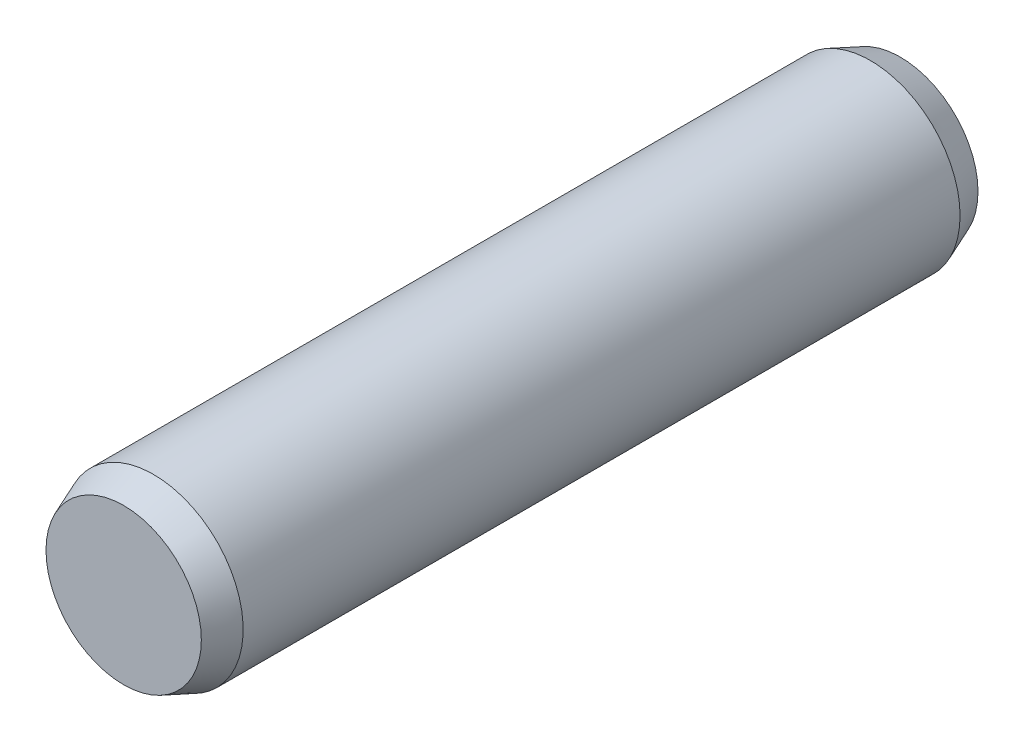
ISO-10303-21;
HEADER;
FILE_DESCRIPTION(('STEP AP214'),'2;1');
FILE_NAME('part.step','',(''),(''),'','','');
FILE_SCHEMA(('AUTOMOTIVE_DESIGN { 1 0 10303 214 1 1 1 1 }'));
ENDSEC;
DATA;
#1=APPLICATION_CONTEXT('core data for automotive mechanical design processes');
#2=APPLICATION_PROTOCOL_DEFINITION('international standard','automotive_design',2000,#1);
#3=PRODUCT_CONTEXT('',#1,'mechanical');
#4=PRODUCT('Part','Part','',(#3));
#5=PRODUCT_RELATED_PRODUCT_CATEGORY('part','',(#4));
#6=PRODUCT_DEFINITION_FORMATION('','',#4);
#7=PRODUCT_DEFINITION_CONTEXT('part definition',#1,'design');
#8=PRODUCT_DEFINITION('design','',#6,#7);
#9=PRODUCT_DEFINITION_SHAPE('','',#8);
#10=(LENGTH_UNIT() NAMED_UNIT(*) SI_UNIT(.MILLI.,.METRE.));
#11=(NAMED_UNIT(*) PLANE_ANGLE_UNIT() SI_UNIT($,.RADIAN.));
#12=(NAMED_UNIT(*) SI_UNIT($,.STERADIAN.) SOLID_ANGLE_UNIT());
#13=UNCERTAINTY_MEASURE_WITH_UNIT(LENGTH_MEASURE(1.E-05),#10,'distance_accuracy_value','');
#14=(GEOMETRIC_REPRESENTATION_CONTEXT(3) GLOBAL_UNCERTAINTY_ASSIGNED_CONTEXT((#13)) GLOBAL_UNIT_ASSIGNED_CONTEXT((#10,
#11,#12)) REPRESENTATION_CONTEXT('',''));
#15=CARTESIAN_POINT('',(0.,0.,0.));
#16=DIRECTION('',(0.,0.,1.));
#17=DIRECTION('',(1.,0.,0.));
#18=AXIS2_PLACEMENT_3D('',#15,#16,#17);
#19=CARTESIAN_POINT('',(0.,0.,6.5));
#20=DIRECTION('',(0.,0.,-1.));
#21=DIRECTION('',(-1.,0.,0.));
#22=AXIS2_PLACEMENT_3D('',#19,#20,#21);
#23=CYLINDRICAL_SURFACE('',#22,1.5);
#24=CARTESIAN_POINT('',(0.,0.,-5.99999999999996));
#25=DIRECTION('',(0.,0.,1.));
#26=DIRECTION('',(1.,0.,0.));
#27=AXIS2_PLACEMENT_3D('',#24,#25,#26);
#28=CIRCLE('',#27,1.5);
#29=CARTESIAN_POINT('',(-1.5,0.,-5.99999999999996));
#30=VERTEX_POINT('',#29);
#31=EDGE_CURVE('E49',#30,#30,#28,.T.);
#32=CARTESIAN_POINT('',(0.,0.,6.00000000000001));
#33=DIRECTION('',(0.,0.,1.));
#34=DIRECTION('',(1.,0.,0.));
#35=AXIS2_PLACEMENT_3D('',#32,#33,#34);
#36=CIRCLE('',#35,1.5);
#37=CARTESIAN_POINT('',(-1.5,0.,6.00000000000001));
#38=VERTEX_POINT('',#37);
#39=EDGE_CURVE('E53',#38,#38,#36,.F.);
#40=CARTESIAN_POINT('',(-1.5,0.,-5.99999999999996));
#41=CARTESIAN_POINT('',(-1.5,0.,-5.87499999999996));
#42=CARTESIAN_POINT('',(-1.5,0.,-5.74999999999996));
#43=CARTESIAN_POINT('',(-1.5,0.,-5.49999999999996));
#44=CARTESIAN_POINT('',(-1.5,0.,-5.37499999999996));
#45=CARTESIAN_POINT('',(-1.5,0.,-5.12499999999996));
#46=CARTESIAN_POINT('',(-1.5,0.,-4.99999999999996));
#47=CARTESIAN_POINT('',(-1.5,0.,-4.74999999999996));
#48=CARTESIAN_POINT('',(-1.5,0.,-4.62499999999996));
#49=CARTESIAN_POINT('',(-1.5,0.,-4.37499999999996));
#50=CARTESIAN_POINT('',(-1.5,0.,-4.24999999999996));
#51=CARTESIAN_POINT('',(-1.5,0.,-3.99999999999996));
#52=CARTESIAN_POINT('',(-1.5,0.,-3.87499999999996));
#53=CARTESIAN_POINT('',(-1.5,0.,-3.62499999999996));
#54=CARTESIAN_POINT('',(-1.5,0.,-3.49999999999997));
#55=CARTESIAN_POINT('',(-1.5,0.,-3.24999999999997));
#56=CARTESIAN_POINT('',(-1.5,0.,-3.12499999999997));
#57=CARTESIAN_POINT('',(-1.5,0.,-2.87499999999997));
#58=CARTESIAN_POINT('',(-1.5,0.,-2.74999999999997));
#59=CARTESIAN_POINT('',(-1.5,0.,-2.49999999999997));
#60=CARTESIAN_POINT('',(-1.5,0.,-2.37499999999997));
#61=CARTESIAN_POINT('',(-1.5,0.,-2.12499999999997));
#62=CARTESIAN_POINT('',(-1.5,0.,-1.99999999999997));
#63=CARTESIAN_POINT('',(-1.5,0.,-1.74999999999997));
#64=CARTESIAN_POINT('',(-1.5,0.,-1.62499999999997));
#65=CARTESIAN_POINT('',(-1.5,0.,-1.37499999999997));
#66=CARTESIAN_POINT('',(-1.5,0.,-1.24999999999997));
#67=CARTESIAN_POINT('',(-1.5,0.,-0.999999999999973));
#68=CARTESIAN_POINT('',(-1.5,0.,-0.874999999999973));
#69=CARTESIAN_POINT('',(-1.5,0.,-0.624999999999974));
#70=CARTESIAN_POINT('',(-1.5,0.,-0.499999999999974));
#71=CARTESIAN_POINT('',(-1.5,0.,-0.249999999999975));
#72=CARTESIAN_POINT('',(-1.5,0.,-0.124999999999975));
#73=CARTESIAN_POINT('',(-1.5,0.,0.125000000000024));
#74=CARTESIAN_POINT('',(-1.5,0.,0.250000000000023));
#75=CARTESIAN_POINT('',(-1.5,0.,0.500000000000023));
#76=CARTESIAN_POINT('',(-1.5,0.,0.625000000000023));
#77=CARTESIAN_POINT('',(-1.5,0.,0.875000000000022));
#78=CARTESIAN_POINT('',(-1.5,0.,1.00000000000002));
#79=CARTESIAN_POINT('',(-1.5,0.,1.25000000000002));
#80=CARTESIAN_POINT('',(-1.5,0.,1.37500000000002));
#81=CARTESIAN_POINT('',(-1.5,0.,1.62500000000002));
#82=CARTESIAN_POINT('',(-1.5,0.,1.75000000000002));
#83=CARTESIAN_POINT('',(-1.5,0.,2.00000000000002));
#84=CARTESIAN_POINT('',(-1.5,0.,2.12500000000002));
#85=CARTESIAN_POINT('',(-1.5,0.,2.37500000000002));
#86=CARTESIAN_POINT('',(-1.5,0.,2.50000000000002));
#87=CARTESIAN_POINT('',(-1.5,0.,2.75000000000002));
#88=CARTESIAN_POINT('',(-1.5,0.,2.87500000000001));
#89=CARTESIAN_POINT('',(-1.5,0.,3.12500000000001));
#90=CARTESIAN_POINT('',(-1.5,0.,3.25000000000001));
#91=CARTESIAN_POINT('',(-1.5,0.,3.50000000000001));
#92=CARTESIAN_POINT('',(-1.5,0.,3.62500000000001));
#93=CARTESIAN_POINT('',(-1.5,0.,3.87500000000001));
#94=CARTESIAN_POINT('',(-1.5,0.,4.00000000000001));
#95=CARTESIAN_POINT('',(-1.5,0.,4.25000000000001));
#96=CARTESIAN_POINT('',(-1.5,0.,4.37500000000001));
#97=CARTESIAN_POINT('',(-1.5,0.,4.62500000000001));
#98=CARTESIAN_POINT('',(-1.5,0.,4.75000000000001));
#99=CARTESIAN_POINT('',(-1.5,0.,5.00000000000001));
#100=CARTESIAN_POINT('',(-1.5,0.,5.12500000000001));
#101=CARTESIAN_POINT('',(-1.5,0.,5.37500000000001));
#102=CARTESIAN_POINT('',(-1.5,0.,5.50000000000001));
#103=CARTESIAN_POINT('',(-1.5,0.,5.75000000000001));
#104=CARTESIAN_POINT('',(-1.5,0.,5.87500000000001));
#105=CARTESIAN_POINT('',(-1.5,0.,6.00000000000001));
#106=B_SPLINE_CURVE_WITH_KNOTS('',3,(#40,#41,#42,#43,#44,#45,#46,#47,#48,#49,#50,#51,#52,#53,
#54,#55,#56,#57,#58,#59,#60,#61,#62,#63,#64,#65,#66,#67,#68,#69,#70,#71,#72,#73,#74,#75,#76,#77,
#78,#79,#80,#81,#82,#83,#84,#85,#86,#87,#88,#89,#90,#91,#92,#93,#94,#95,#96,#97,#98,#99,#100,
#101,#102,#103,#104,#105),.UNSPECIFIED.,.F.,.F.,(4,2,2,2,2,2,2,2,2,2,2,2,2,2,2,2,2,2,2,2,2,2,2,
2,2,2,2,2,2,2,2,2,4),(0.,0.374999999999999,0.749999999999997,1.125,1.5,1.87499999999999,
2.24999999999999,2.62499999999999,2.99999999999999,3.37499999999999,3.74999999999999,
4.12499999999999,4.49999999999999,4.87499999999998,5.24999999999998,5.62499999999998,
5.99999999999998,6.37499999999998,6.74999999999998,7.12499999999998,7.49999999999998,
7.87499999999998,8.24999999999998,8.62499999999997,8.99999999999997,9.37499999999997,
9.74999999999997,10.125,10.5,10.875,11.25,11.625,12.),.UNSPECIFIED.);
#107=EDGE_CURVE('BSEAM41',#30,#38,#106,.T.);
#108=ORIENTED_EDGE('',*,*,#31,.T.);
#109=ORIENTED_EDGE('',*,*,#39,.T.);
#110=ORIENTED_EDGE('',*,*,#107,.T.);
#111=ORIENTED_EDGE('',*,*,#107,.F.);
#112=EDGE_LOOP('',(#108,#110,#109,#111));
#113=FACE_BOUND('',#112,.T.);
#114=ADVANCED_FACE('F41',(#113),#23,.T.);
#115=CARTESIAN_POINT('',(0.,0.,6.5));
#116=DIRECTION('',(0.,0.,1.));
#117=DIRECTION('',(1.,0.,0.));
#118=AXIS2_PLACEMENT_3D('',#115,#116,#117);
#119=PLANE('',#118);
#120=CARTESIAN_POINT('',(0.,0.,6.5));
#121=DIRECTION('',(0.,0.,1.));
#122=DIRECTION('',(1.,0.,0.));
#123=AXIS2_PLACEMENT_3D('',#120,#121,#122);
#124=CIRCLE('',#123,1.3);
#125=CARTESIAN_POINT('',(1.3,0.,6.5));
#126=VERTEX_POINT('',#125);
#127=EDGE_CURVE('E57',#126,#126,#124,.T.);
#128=ORIENTED_EDGE('',*,*,#127,.T.);
#129=EDGE_LOOP('',(#128));
#130=FACE_BOUND('',#129,.T.);
#131=ADVANCED_FACE('F63',(#130),#119,.T.);
#132=CARTESIAN_POINT('',(0.,0.,-6.5));
#133=DIRECTION('',(0.,0.,1.));
#134=DIRECTION('',(1.,0.,0.));
#135=AXIS2_PLACEMENT_3D('',#132,#133,#134);
#136=PLANE('',#135);
#137=CARTESIAN_POINT('',(0.,0.,-6.5));
#138=DIRECTION('',(0.,0.,1.));
#139=DIRECTION('',(1.,0.,0.));
#140=AXIS2_PLACEMENT_3D('',#137,#138,#139);
#141=CIRCLE('',#140,1.29999999999998);
#142=CARTESIAN_POINT('',(1.29999999999998,0.,-6.5));
#143=VERTEX_POINT('',#142);
#144=EDGE_CURVE('E10',#143,#143,#141,.F.);
#145=ORIENTED_EDGE('',*,*,#144,.T.);
#146=EDGE_LOOP('',(#145));
#147=FACE_BOUND('',#146,.T.);
#148=ADVANCED_FACE('F67',(#147),#136,.F.);
#149=CARTESIAN_POINT('',(0.,0.,6.5));
#150=DIRECTION('',(0.,0.,-1.));
#151=DIRECTION('',(-1.,0.,0.));
#152=AXIS2_PLACEMENT_3D('',#149,#150,#151);
#153=CONICAL_SURFACE('',#152,1.3,0.380506377112362);
#154=ORIENTED_EDGE('',*,*,#39,.F.);
#155=EDGE_LOOP('',(#154));
#156=FACE_BOUND('',#155,.T.);
#157=ORIENTED_EDGE('',*,*,#127,.F.);
#158=EDGE_LOOP('',(#157));
#159=FACE_BOUND('',#158,.T.);
#160=ADVANCED_FACE('F65',(#156,#159),#153,.T.);
#161=CARTESIAN_POINT('',(0.,0.,-5.99999999999996));
#162=DIRECTION('',(0.,0.,1.));
#163=DIRECTION('',(1.,0.,0.));
#164=AXIS2_PLACEMENT_3D('',#161,#162,#163);
#165=CONICAL_SURFACE('',#164,1.5,0.380506377112365);
#166=ORIENTED_EDGE('',*,*,#144,.F.);
#167=EDGE_LOOP('',(#166));
#168=FACE_BOUND('',#167,.T.);
#169=ORIENTED_EDGE('',*,*,#31,.F.);
#170=EDGE_LOOP('',(#169));
#171=FACE_BOUND('',#170,.T.);
#172=ADVANCED_FACE('F44',(#168,#171),#165,.T.);
#173=CLOSED_SHELL('',(#114,#131,#148,#160,#172));
#174=MANIFOLD_SOLID_BREP('B2',#173);
#175=ADVANCED_BREP_SHAPE_REPRESENTATION('',(#18,#174),#14);
#176=SHAPE_DEFINITION_REPRESENTATION(#9,#175);
ENDSEC;
END-ISO-10303-21;
